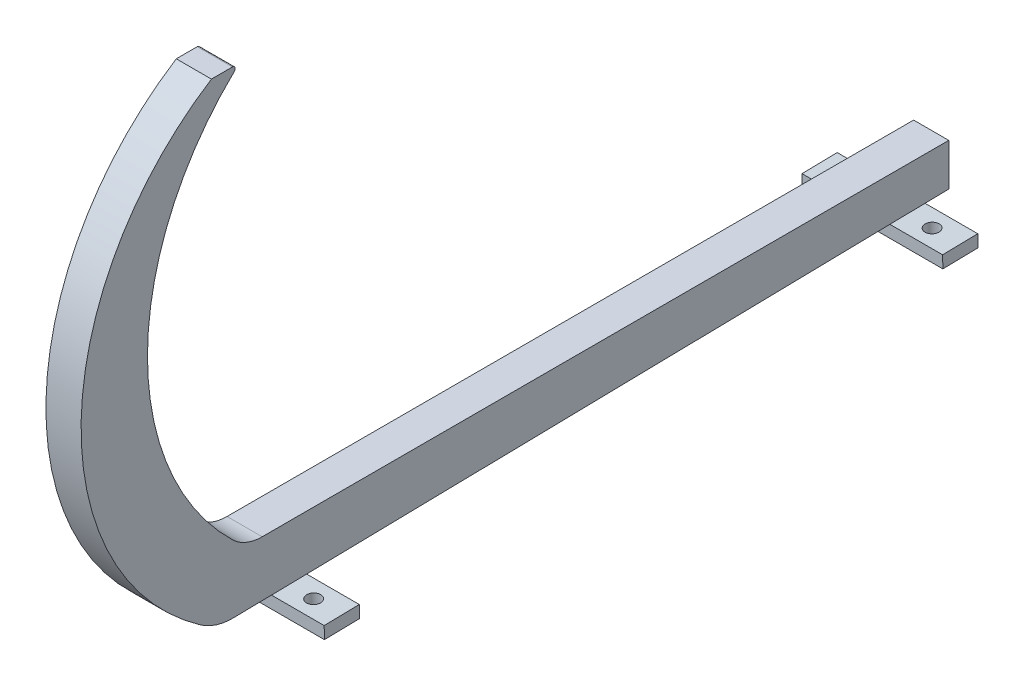
ISO-10303-21;
HEADER;
FILE_DESCRIPTION(('STEP AP214'),'2;1');
FILE_NAME('part.step','',(''),(''),'','','');
FILE_SCHEMA(('AUTOMOTIVE_DESIGN { 1 0 10303 214 1 1 1 1 }'));
ENDSEC;
DATA;
#1=APPLICATION_CONTEXT('core data for automotive mechanical design processes');
#2=APPLICATION_PROTOCOL_DEFINITION('international standard','automotive_design',2000,#1);
#3=PRODUCT_CONTEXT('',#1,'mechanical');
#4=PRODUCT('Part','Part','',(#3));
#5=PRODUCT_RELATED_PRODUCT_CATEGORY('part','',(#4));
#6=PRODUCT_DEFINITION_FORMATION('','',#4);
#7=PRODUCT_DEFINITION_CONTEXT('part definition',#1,'design');
#8=PRODUCT_DEFINITION('design','',#6,#7);
#9=PRODUCT_DEFINITION_SHAPE('','',#8);
#10=(LENGTH_UNIT() NAMED_UNIT(*) SI_UNIT(.MILLI.,.METRE.));
#11=(NAMED_UNIT(*) PLANE_ANGLE_UNIT() SI_UNIT($,.RADIAN.));
#12=(NAMED_UNIT(*) SI_UNIT($,.STERADIAN.) SOLID_ANGLE_UNIT());
#13=UNCERTAINTY_MEASURE_WITH_UNIT(LENGTH_MEASURE(1.E-05),#10,'distance_accuracy_value','');
#14=(GEOMETRIC_REPRESENTATION_CONTEXT(3) GLOBAL_UNCERTAINTY_ASSIGNED_CONTEXT((#13)) GLOBAL_UNIT_ASSIGNED_CONTEXT((#10,
#11,#12)) REPRESENTATION_CONTEXT('',''));
#15=CARTESIAN_POINT('',(0.,0.,0.));
#16=DIRECTION('',(0.,0.,1.));
#17=DIRECTION('',(1.,0.,0.));
#18=AXIS2_PLACEMENT_3D('',#15,#16,#17);
#19=CARTESIAN_POINT('',(15.875,-38.1,-317.5));
#20=DIRECTION('',(0.,0.999815576773598,0.0192044901228458));
#21=DIRECTION('',(0.,-0.0192044901228458,0.999815576773598));
#22=AXIS2_PLACEMENT_3D('',#19,#20,#21);
#23=PLANE('',#22);
#24=DIRECTION('',(1.,0.,0.));
#25=VECTOR('',#24,1.);
#26=CARTESIAN_POINT('',(-63.5000000000001,-49.2431126127245,262.627745786432));
#27=LINE('',#26,#25);
#28=CARTESIAN_POINT('',(-15.875,-49.2431126127245,262.627745786431));
#29=VERTEX_POINT('',#28);
#30=CARTESIAN_POINT('',(15.875,-49.2431126127245,262.627745786431));
#31=VERTEX_POINT('',#30);
#32=EDGE_CURVE('E326',#29,#31,#27,.T.);
#33=ORIENTED_EDGE('',*,*,#32,.F.);
#34=DIRECTION('',(0.,0.0192044901228458,-0.999815576773597));
#35=VECTOR('',#34,1.);
#36=CARTESIAN_POINT('',(-15.875,-38.1,-317.5));
#37=LINE('',#36,#35);
#38=CARTESIAN_POINT('',(-15.875,-39.1213860934786,-264.325053952093));
#39=VERTEX_POINT('',#38);
#40=EDGE_CURVE('E419',#29,#39,#37,.T.);
#41=ORIENTED_EDGE('',*,*,#40,.T.);
#42=DIRECTION('',(-1.,0.,0.));
#43=VECTOR('',#42,1.);
#44=CARTESIAN_POINT('',(-63.5000000000001,-39.1213860934786,-264.325053952093));
#45=LINE('',#44,#43);
#46=CARTESIAN_POINT('',(15.875,-39.1213860934786,-264.325053952093));
#47=VERTEX_POINT('',#46);
#48=EDGE_CURVE('E237',#47,#39,#45,.T.);
#49=ORIENTED_EDGE('',*,*,#48,.F.);
#50=DIRECTION('',(0.,0.0192044901228458,-0.999815576773597));
#51=VECTOR('',#50,1.);
#52=CARTESIAN_POINT('',(15.875,-38.1,-317.5));
#53=LINE('',#52,#51);
#54=EDGE_CURVE('E433',#31,#47,#53,.T.);
#55=ORIENTED_EDGE('',*,*,#54,.F.);
#56=EDGE_LOOP('',(#33,#41,#49,#55));
#57=FACE_BOUND('',#56,.T.);
#58=ADVANCED_FACE('F39',(#57),#23,.F.);
#59=DIRECTION('',(-1.,0.,0.));
#60=VECTOR('',#59,1.);
#61=CARTESIAN_POINT('',(-63.5000000000001,-49.8528551741249,294.371890348993));
#62=LINE('',#61,#60);
#63=CARTESIAN_POINT('',(15.875,-49.8528551741249,294.371890348993));
#64=VERTEX_POINT('',#63);
#65=CARTESIAN_POINT('',(-15.875,-49.8528551741249,294.371890348993));
#66=VERTEX_POINT('',#65);
#67=EDGE_CURVE('E332',#64,#66,#62,.T.);
#68=ORIENTED_EDGE('',*,*,#67,.F.);
#69=CARTESIAN_POINT('',(15.875,-50.500975577727,328.11404497018));
#70=VERTEX_POINT('',#69);
#71=EDGE_CURVE('E283',#70,#64,#53,.T.);
#72=ORIENTED_EDGE('',*,*,#71,.F.);
#73=DIRECTION('',(-1.,0.,0.));
#74=VECTOR('',#73,1.);
#75=CARTESIAN_POINT('',(15.875,-50.500975577727,328.11404497018));
#76=LINE('',#75,#74);
#77=CARTESIAN_POINT('',(-15.875,-50.500975577727,328.11404497018));
#78=VERTEX_POINT('',#77);
#79=EDGE_CURVE('E305',#70,#78,#76,.T.);
#80=ORIENTED_EDGE('',*,*,#79,.T.);
#81=EDGE_CURVE('E271',#78,#66,#37,.T.);
#82=ORIENTED_EDGE('',*,*,#81,.T.);
#83=EDGE_LOOP('',(#68,#72,#80,#82));
#84=FACE_BOUND('',#83,.T.);
#85=ADVANCED_FACE('F382',(#84),#23,.F.);
#86=DIRECTION('',(1.,0.,0.));
#87=VECTOR('',#86,1.);
#88=CARTESIAN_POINT('',(-63.5000000000001,-38.5116435320783,-296.069198514655));
#89=LINE('',#88,#87);
#90=CARTESIAN_POINT('',(-15.875,-38.5116435320783,-296.069198514655));
#91=VERTEX_POINT('',#90);
#92=CARTESIAN_POINT('',(15.875,-38.5116435320783,-296.069198514655));
#93=VERTEX_POINT('',#92);
#94=EDGE_CURVE('E245',#91,#93,#89,.T.);
#95=ORIENTED_EDGE('',*,*,#94,.F.);
#96=CARTESIAN_POINT('',(-15.875,-38.1,-317.5));
#97=VERTEX_POINT('',#96);
#98=EDGE_CURVE('E297',#91,#97,#37,.T.);
#99=ORIENTED_EDGE('',*,*,#98,.T.);
#100=DIRECTION('',(-1.,0.,0.));
#101=VECTOR('',#100,1.);
#102=CARTESIAN_POINT('',(15.875,-38.1,-317.5));
#103=LINE('',#102,#101);
#104=CARTESIAN_POINT('',(15.875,-38.1,-317.5));
#105=VERTEX_POINT('',#104);
#106=EDGE_CURVE('E286',#105,#97,#103,.T.);
#107=ORIENTED_EDGE('',*,*,#106,.F.);
#108=EDGE_CURVE('E285',#93,#105,#53,.T.);
#109=ORIENTED_EDGE('',*,*,#108,.F.);
#110=EDGE_LOOP('',(#95,#99,#107,#109));
#111=FACE_BOUND('',#110,.T.);
#112=ADVANCED_FACE('F387',(#111),#23,.F.);
#113=CARTESIAN_POINT('',(15.875,0.,-317.5));
#114=DIRECTION('',(0.,0.,1.));
#115=DIRECTION('',(1.,0.,0.));
#116=AXIS2_PLACEMENT_3D('',#113,#114,#115);
#117=PLANE('',#116);
#118=DIRECTION('',(0.,1.,0.));
#119=VECTOR('',#118,1.);
#120=CARTESIAN_POINT('',(-15.875,0.,-317.5));
#121=LINE('',#120,#119);
#122=CARTESIAN_POINT('',(-15.875,0.,-317.5));
#123=VERTEX_POINT('',#122);
#124=EDGE_CURVE('E207',#97,#123,#121,.T.);
#125=ORIENTED_EDGE('',*,*,#124,.T.);
#126=DIRECTION('',(-1.,0.,0.));
#127=VECTOR('',#126,1.);
#128=CARTESIAN_POINT('',(15.875,0.,-317.5));
#129=LINE('',#128,#127);
#130=CARTESIAN_POINT('',(15.875,0.,-317.5));
#131=VERTEX_POINT('',#130);
#132=EDGE_CURVE('E319',#131,#123,#129,.T.);
#133=ORIENTED_EDGE('',*,*,#132,.F.);
#134=DIRECTION('',(0.,1.,0.));
#135=VECTOR('',#134,1.);
#136=CARTESIAN_POINT('',(15.875,0.,-317.5));
#137=LINE('',#136,#135);
#138=EDGE_CURVE('E270',#105,#131,#137,.T.);
#139=ORIENTED_EDGE('',*,*,#138,.F.);
#140=ORIENTED_EDGE('',*,*,#106,.T.);
#141=EDGE_LOOP('',(#125,#133,#139,#140));
#142=FACE_BOUND('',#141,.T.);
#143=ADVANCED_FACE('F392',(#142),#117,.F.);
#144=CARTESIAN_POINT('',(15.875,0.,-317.5));
#145=DIRECTION('',(0.,-1.,0.));
#146=DIRECTION('',(0.,0.,-1.));
#147=AXIS2_PLACEMENT_3D('',#144,#145,#146);
#148=PLANE('',#147);
#149=DIRECTION('',(0.,0.,1.));
#150=VECTOR('',#149,1.);
#151=CARTESIAN_POINT('',(-15.875,0.,-317.5));
#152=LINE('',#151,#150);
#153=CARTESIAN_POINT('',(-15.875,0.,302.771488663165));
#154=VERTEX_POINT('',#153);
#155=EDGE_CURVE('E215',#123,#154,#152,.T.);
#156=ORIENTED_EDGE('',*,*,#155,.T.);
#157=DIRECTION('',(-1.,0.,0.));
#158=VECTOR('',#157,1.);
#159=CARTESIAN_POINT('',(15.875,0.,302.771488663165));
#160=LINE('',#159,#158);
#161=CARTESIAN_POINT('',(15.875,0.,302.771488663165));
#162=VERTEX_POINT('',#161);
#163=EDGE_CURVE('E320',#162,#154,#160,.T.);
#164=ORIENTED_EDGE('',*,*,#163,.F.);
#165=DIRECTION('',(0.,0.,1.));
#166=VECTOR('',#165,1.);
#167=CARTESIAN_POINT('',(15.875,0.,-317.5));
#168=LINE('',#167,#166);
#169=EDGE_CURVE('E269',#131,#162,#168,.T.);
#170=ORIENTED_EDGE('',*,*,#169,.F.);
#171=ORIENTED_EDGE('',*,*,#132,.T.);
#172=EDGE_LOOP('',(#156,#164,#170,#171));
#173=FACE_BOUND('',#172,.T.);
#174=ADVANCED_FACE('F402',(#173),#148,.F.);
#175=CARTESIAN_POINT('',(15.875,38.0999999999999,302.771488663165));
#176=DIRECTION('',(-1.,0.,0.));
#177=DIRECTION('',(0.,0.,1.));
#178=AXIS2_PLACEMENT_3D('',#175,#176,#177);
#179=CYLINDRICAL_SURFACE('',#178,38.1);
#180=CARTESIAN_POINT('',(-15.875,38.0999999999999,302.771488663165));
#181=DIRECTION('',(-1.,0.,0.));
#182=DIRECTION('',(0.,0.,1.));
#183=AXIS2_PLACEMENT_3D('',#180,#181,#182);
#184=CIRCLE('',#183,38.1);
#185=CARTESIAN_POINT('',(-15.875,10.7605961028798,329.307633721371));
#186=VERTEX_POINT('',#185);
#187=EDGE_CURVE('E290',#154,#186,#184,.T.);
#188=ORIENTED_EDGE('',*,*,#187,.T.);
#189=DIRECTION('',(-1.,0.,0.));
#190=VECTOR('',#189,1.);
#191=CARTESIAN_POINT('',(15.875,10.7605961028798,329.307633721371));
#192=LINE('',#191,#190);
#193=CARTESIAN_POINT('',(15.875,10.7605961028798,329.307633721371));
#194=VERTEX_POINT('',#193);
#195=EDGE_CURVE('E314',#194,#186,#192,.T.);
#196=ORIENTED_EDGE('',*,*,#195,.F.);
#197=CARTESIAN_POINT('',(15.875,38.0999999999999,302.771488663165));
#198=DIRECTION('',(-1.,0.,0.));
#199=DIRECTION('',(0.,0.,1.));
#200=AXIS2_PLACEMENT_3D('',#197,#198,#199);
#201=CIRCLE('',#200,38.1);
#202=EDGE_CURVE('E272',#162,#194,#201,.T.);
#203=ORIENTED_EDGE('',*,*,#202,.F.);
#204=ORIENTED_EDGE('',*,*,#163,.T.);
#205=EDGE_LOOP('',(#188,#196,#203,#204));
#206=FACE_BOUND('',#205,.T.);
#207=ADVANCED_FACE('F451',(#206),#179,.F.);
#208=CARTESIAN_POINT('',(15.875,193.023288750347,152.4));
#209=DIRECTION('',(-1.,0.,0.));
#210=DIRECTION('',(0.,0.,1.));
#211=AXIS2_PLACEMENT_3D('',#208,#209,#210);
#212=CYLINDRICAL_SURFACE('',#211,254.);
#213=CARTESIAN_POINT('',(-15.875,193.023288750347,152.4));
#214=DIRECTION('',(-1.,0.,0.));
#215=DIRECTION('',(0.,0.,1.));
#216=AXIS2_PLACEMENT_3D('',#213,#214,#215);
#217=CIRCLE('',#216,254.);
#218=CARTESIAN_POINT('',(-15.875,376.623992957924,327.918607032081));
#219=VERTEX_POINT('',#218);
#220=EDGE_CURVE('E295',#186,#219,#217,.T.);
#221=ORIENTED_EDGE('',*,*,#220,.T.);
#222=DIRECTION('',(-1.,0.,0.));
#223=VECTOR('',#222,1.);
#224=CARTESIAN_POINT('',(15.875,376.623992957924,327.918607032081));
#225=LINE('',#224,#223);
#226=CARTESIAN_POINT('',(15.875,376.623992957924,327.918607032081));
#227=VERTEX_POINT('',#226);
#228=EDGE_CURVE('E50',#219,#227,#225,.F.);
#229=ORIENTED_EDGE('',*,*,#228,.T.);
#230=CARTESIAN_POINT('',(15.875,193.023288750347,152.4));
#231=DIRECTION('',(-1.,0.,0.));
#232=DIRECTION('',(0.,0.,1.));
#233=AXIS2_PLACEMENT_3D('',#230,#231,#232);
#234=CIRCLE('',#233,254.);
#235=EDGE_CURVE('E274',#194,#227,#234,.T.);
#236=ORIENTED_EDGE('',*,*,#235,.F.);
#237=ORIENTED_EDGE('',*,*,#195,.T.);
#238=EDGE_LOOP('',(#221,#229,#236,#237));
#239=FACE_BOUND('',#238,.T.);
#240=ADVANCED_FACE('F454',(#239),#212,.F.);
#241=CARTESIAN_POINT('',(15.875,381.,348.62375721124));
#242=DIRECTION('',(0.,-1.,0.));
#243=DIRECTION('',(0.,0.,-1.));
#244=AXIS2_PLACEMENT_3D('',#241,#242,#243);
#245=PLANE('',#244);
#246=DIRECTION('',(0.,0.,1.));
#247=VECTOR('',#246,1.);
#248=CARTESIAN_POINT('',(15.875,381.,348.62375721124));
#249=LINE('',#248,#247);
#250=CARTESIAN_POINT('',(15.875,381.,329.673793102401));
#251=VERTEX_POINT('',#250);
#252=CARTESIAN_POINT('',(15.875,381.,348.62375721124));
#253=VERTEX_POINT('',#252);
#254=EDGE_CURVE('E280',#251,#253,#249,.T.);
#255=ORIENTED_EDGE('',*,*,#254,.F.);
#256=DIRECTION('',(-1.,0.,0.));
#257=VECTOR('',#256,1.);
#258=CARTESIAN_POINT('',(15.875,381.,329.673793102401));
#259=LINE('',#258,#257);
#260=CARTESIAN_POINT('',(-15.875,381.,329.673793102401));
#261=VERTEX_POINT('',#260);
#262=EDGE_CURVE('E323',#251,#261,#259,.T.);
#263=ORIENTED_EDGE('',*,*,#262,.T.);
#264=DIRECTION('',(0.,0.,1.));
#265=VECTOR('',#264,1.);
#266=CARTESIAN_POINT('',(-15.875,381.,348.62375721124));
#267=LINE('',#266,#265);
#268=CARTESIAN_POINT('',(-15.875,381.,348.62375721124));
#269=VERTEX_POINT('',#268);
#270=EDGE_CURVE('E294',#261,#269,#267,.T.);
#271=ORIENTED_EDGE('',*,*,#270,.T.);
#272=DIRECTION('',(-1.,0.,0.));
#273=VECTOR('',#272,1.);
#274=CARTESIAN_POINT('',(15.875,381.,348.62375721124));
#275=LINE('',#274,#273);
#276=EDGE_CURVE('E313',#253,#269,#275,.T.);
#277=ORIENTED_EDGE('',*,*,#276,.F.);
#278=EDGE_LOOP('',(#255,#263,#271,#277));
#279=FACE_BOUND('',#278,.T.);
#280=ADVANCED_FACE('F455',(#279),#245,.F.);
#281=CARTESIAN_POINT('',(15.875,166.631038126727,212.381516384927));
#282=DIRECTION('',(-1.,0.,0.));
#283=DIRECTION('',(0.,0.,1.));
#284=AXIS2_PLACEMENT_3D('',#281,#282,#283);
#285=CYLINDRICAL_SURFACE('',#284,254.);
#286=CARTESIAN_POINT('',(-15.875,166.631038126727,212.381516384927));
#287=DIRECTION('',(1.,0.,0.));
#288=DIRECTION('',(0.,0.,1.));
#289=AXIS2_PLACEMENT_3D('',#286,#287,#288);
#290=CIRCLE('',#289,254.);
#291=CARTESIAN_POINT('',(-15.875,-41.2956898787171,358.266662239294));
#292=VERTEX_POINT('',#291);
#293=EDGE_CURVE('E299',#269,#292,#290,.T.);
#294=ORIENTED_EDGE('',*,*,#293,.T.);
#295=DIRECTION('',(-1.,0.,0.));
#296=VECTOR('',#295,1.);
#297=CARTESIAN_POINT('',(15.875,-41.2956898787171,358.266662239294));
#298=LINE('',#297,#296);
#299=CARTESIAN_POINT('',(15.875,-41.2956898787171,358.266662239294));
#300=VERTEX_POINT('',#299);
#301=EDGE_CURVE('E306',#300,#292,#298,.T.);
#302=ORIENTED_EDGE('',*,*,#301,.F.);
#303=CARTESIAN_POINT('',(15.875,166.631038126727,212.381516384927));
#304=DIRECTION('',(1.,0.,0.));
#305=DIRECTION('',(0.,0.,1.));
#306=AXIS2_PLACEMENT_3D('',#303,#304,#305);
#307=CIRCLE('',#306,254.);
#308=EDGE_CURVE('E276',#253,#300,#307,.T.);
#309=ORIENTED_EDGE('',*,*,#308,.F.);
#310=ORIENTED_EDGE('',*,*,#276,.T.);
#311=EDGE_LOOP('',(#294,#302,#309,#310));
#312=FACE_BOUND('',#311,.T.);
#313=ADVANCED_FACE('F464',(#312),#285,.T.);
#314=CARTESIAN_POINT('',(15.875,0.289655722371815,329.089633068421));
#315=DIRECTION('',(-1.,0.,0.));
#316=DIRECTION('',(0.,0.,1.));
#317=AXIS2_PLACEMENT_3D('',#314,#315,#316);
#318=CYLINDRICAL_SURFACE('',#317,50.8);
#319=CARTESIAN_POINT('',(-15.875,0.289655722371815,329.089633068421));
#320=DIRECTION('',(1.,0.,0.));
#321=DIRECTION('',(0.,0.,1.));
#322=AXIS2_PLACEMENT_3D('',#319,#320,#321);
#323=CIRCLE('',#322,50.8);
#324=EDGE_CURVE('E300',#292,#78,#323,.T.);
#325=ORIENTED_EDGE('',*,*,#324,.T.);
#326=ORIENTED_EDGE('',*,*,#79,.F.);
#327=CARTESIAN_POINT('',(15.875,0.289655722371815,329.089633068421));
#328=DIRECTION('',(1.,0.,0.));
#329=DIRECTION('',(0.,0.,1.));
#330=AXIS2_PLACEMENT_3D('',#327,#328,#329);
#331=CIRCLE('',#330,50.8);
#332=EDGE_CURVE('E284',#300,#70,#331,.T.);
#333=ORIENTED_EDGE('',*,*,#332,.F.);
#334=ORIENTED_EDGE('',*,*,#301,.T.);
#335=EDGE_LOOP('',(#325,#326,#333,#334));
#336=FACE_BOUND('',#335,.T.);
#337=ADVANCED_FACE('F483',(#336),#318,.T.);
#338=CARTESIAN_POINT('',(15.875,0.289655722371815,329.089633068421));
#339=DIRECTION('',(-1.,0.,0.));
#340=DIRECTION('',(0.,0.,1.));
#341=AXIS2_PLACEMENT_3D('',#338,#339,#340);
#342=PLANE('',#341);
#343=ORIENTED_EDGE('',*,*,#235,.T.);
#344=CARTESIAN_POINT('',(15.875,378.46,329.673793102401));
#345=DIRECTION('',(-1.,0.,0.));
#346=DIRECTION('',(0.,0.,1.));
#347=AXIS2_PLACEMENT_3D('',#344,#345,#346);
#348=CIRCLE('',#347,2.54);
#349=EDGE_CURVE('E11',#227,#251,#348,.F.);
#350=ORIENTED_EDGE('',*,*,#349,.T.);
#351=ORIENTED_EDGE('',*,*,#254,.T.);
#352=ORIENTED_EDGE('',*,*,#308,.T.);
#353=ORIENTED_EDGE('',*,*,#332,.T.);
#354=ORIENTED_EDGE('',*,*,#71,.T.);
#355=EDGE_CURVE('E287',#64,#31,#53,.T.);
#356=ORIENTED_EDGE('',*,*,#355,.T.);
#357=ORIENTED_EDGE('',*,*,#54,.T.);
#358=EDGE_CURVE('E437',#47,#93,#53,.T.);
#359=ORIENTED_EDGE('',*,*,#358,.T.);
#360=ORIENTED_EDGE('',*,*,#108,.T.);
#361=ORIENTED_EDGE('',*,*,#138,.T.);
#362=ORIENTED_EDGE('',*,*,#169,.T.);
#363=ORIENTED_EDGE('',*,*,#202,.T.);
#364=EDGE_LOOP('',(#343,#350,#351,#352,#353,#354,#356,#357,#359,#360,#361,#362,#363));
#365=FACE_BOUND('',#364,.T.);
#366=ADVANCED_FACE('F440',(#365),#342,.F.);
#367=CARTESIAN_POINT('',(-15.875,0.289655722371815,329.089633068421));
#368=DIRECTION('',(-1.,0.,0.));
#369=DIRECTION('',(0.,0.,1.));
#370=AXIS2_PLACEMENT_3D('',#367,#368,#369);
#371=PLANE('',#370);
#372=ORIENTED_EDGE('',*,*,#270,.F.);
#373=CARTESIAN_POINT('',(-15.875,378.46,329.673793102401));
#374=DIRECTION('',(-1.,0.,0.));
#375=DIRECTION('',(0.,0.,1.));
#376=AXIS2_PLACEMENT_3D('',#373,#374,#375);
#377=CIRCLE('',#376,2.54);
#378=EDGE_CURVE('E64',#261,#219,#377,.T.);
#379=ORIENTED_EDGE('',*,*,#378,.T.);
#380=ORIENTED_EDGE('',*,*,#220,.F.);
#381=ORIENTED_EDGE('',*,*,#187,.F.);
#382=ORIENTED_EDGE('',*,*,#155,.F.);
#383=ORIENTED_EDGE('',*,*,#124,.F.);
#384=ORIENTED_EDGE('',*,*,#98,.F.);
#385=EDGE_CURVE('E414',#39,#91,#37,.T.);
#386=ORIENTED_EDGE('',*,*,#385,.F.);
#387=ORIENTED_EDGE('',*,*,#40,.F.);
#388=EDGE_CURVE('E302',#66,#29,#37,.T.);
#389=ORIENTED_EDGE('',*,*,#388,.F.);
#390=ORIENTED_EDGE('',*,*,#81,.F.);
#391=ORIENTED_EDGE('',*,*,#324,.F.);
#392=ORIENTED_EDGE('',*,*,#293,.F.);
#393=EDGE_LOOP('',(#372,#379,#380,#381,#382,#383,#384,#386,#387,#389,#390,#391,#392));
#394=FACE_BOUND('',#393,.T.);
#395=ADVANCED_FACE('F411',(#394),#371,.T.);
#396=CARTESIAN_POINT('',(0.,-44.1822493531016,-0.848654082830805));
#397=DIRECTION('',(0.,0.999815576773598,0.0192044901228458));
#398=DIRECTION('',(0.,-0.0192044901228458,0.999815576773598));
#399=AXIS2_PLACEMENT_3D('',#396,#397,#398);
#400=PLANE('',#399);
#401=CARTESIAN_POINT('',(38.1,-38.8165148127785,-280.197126233374));
#402=DIRECTION('',(0.,-0.999815576773598,-0.0192044901228458));
#403=DIRECTION('',(0.,-0.0192044901228458,0.999815576773598));
#404=AXIS2_PLACEMENT_3D('',#401,#402,#403);
#405=CIRCLE('',#404,6.35);
#406=CARTESIAN_POINT('',(38.1,-38.9384633250585,-273.848297320862));
#407=VERTEX_POINT('',#406);
#408=EDGE_CURVE('E261',#407,#407,#405,.T.);
#409=ORIENTED_EDGE('',*,*,#408,.T.);
#410=EDGE_LOOP('',(#409));
#411=FACE_BOUND('',#410,.T.);
#412=ORIENTED_EDGE('',*,*,#358,.F.);
#413=CARTESIAN_POINT('',(63.4999999999999,-39.1213860934786,-264.325053952093));
#414=VERTEX_POINT('',#413);
#415=EDGE_CURVE('E231',#414,#47,#45,.T.);
#416=ORIENTED_EDGE('',*,*,#415,.F.);
#417=DIRECTION('',(0.,-0.0192044901228458,0.999815576773597));
#418=VECTOR('',#417,1.);
#419=CARTESIAN_POINT('',(63.4999999999999,-38.5116435320783,-296.069198514655));
#420=LINE('',#419,#418);
#421=CARTESIAN_POINT('',(63.4999999999999,-38.5116435320783,-296.069198514655));
#422=VERTEX_POINT('',#421);
#423=EDGE_CURVE('E233',#422,#414,#420,.T.);
#424=ORIENTED_EDGE('',*,*,#423,.F.);
#425=EDGE_CURVE('E236',#93,#422,#89,.T.);
#426=ORIENTED_EDGE('',*,*,#425,.F.);
#427=EDGE_LOOP('',(#412,#416,#424,#426));
#428=FACE_BOUND('',#427,.T.);
#429=ADVANCED_FACE('F442',(#411,#428),#400,.T.);
#430=CARTESIAN_POINT('',(0.,-55.3561882391233,-1.06328346444373));
#431=DIRECTION('',(0.,0.999815576773598,0.0192044901228458));
#432=DIRECTION('',(0.,-0.0192044901228458,0.999815576773598));
#433=AXIS2_PLACEMENT_3D('',#430,#431,#432);
#434=PLANE('',#433);
#435=DIRECTION('',(0.,0.0192044901228458,-0.999815576773597));
#436=VECTOR('',#435,1.);
#437=CARTESIAN_POINT('',(-63.5000000000001,-49.6855824181,-296.283827896268));
#438=LINE('',#437,#436);
#439=CARTESIAN_POINT('',(-63.5000000000001,-50.2953249795004,-264.539683333706));
#440=VERTEX_POINT('',#439);
#441=CARTESIAN_POINT('',(-63.5000000000001,-49.6855824181,-296.283827896268));
#442=VERTEX_POINT('',#441);
#443=EDGE_CURVE('E252',#440,#442,#438,.T.);
#444=ORIENTED_EDGE('',*,*,#443,.T.);
#445=DIRECTION('',(1.,0.,0.));
#446=VECTOR('',#445,1.);
#447=CARTESIAN_POINT('',(-63.5000000000001,-49.6855824181,-296.283827896268));
#448=LINE('',#447,#446);
#449=CARTESIAN_POINT('',(63.4999999999999,-49.6855824181,-296.283827896268));
#450=VERTEX_POINT('',#449);
#451=EDGE_CURVE('E250',#442,#450,#448,.T.);
#452=ORIENTED_EDGE('',*,*,#451,.T.);
#453=DIRECTION('',(0.,-0.0192044901228458,0.999815576773597));
#454=VECTOR('',#453,1.);
#455=CARTESIAN_POINT('',(63.4999999999999,-49.6855824181,-296.283827896268));
#456=LINE('',#455,#454);
#457=CARTESIAN_POINT('',(63.4999999999999,-50.2953249795004,-264.539683333706));
#458=VERTEX_POINT('',#457);
#459=EDGE_CURVE('E249',#450,#458,#456,.T.);
#460=ORIENTED_EDGE('',*,*,#459,.T.);
#461=DIRECTION('',(-1.,0.,0.));
#462=VECTOR('',#461,1.);
#463=CARTESIAN_POINT('',(-63.5000000000001,-50.2953249795004,-264.539683333706));
#464=LINE('',#463,#462);
#465=EDGE_CURVE('E227',#458,#440,#464,.T.);
#466=ORIENTED_EDGE('',*,*,#465,.T.);
#467=EDGE_LOOP('',(#444,#452,#460,#466));
#468=FACE_BOUND('',#467,.T.);
#469=CARTESIAN_POINT('',(-38.1,-49.9904536988002,-280.411755614987));
#470=DIRECTION('',(0.,-0.999815576773598,-0.0192044901228458));
#471=DIRECTION('',(0.,-0.0192044901228458,0.999815576773598));
#472=AXIS2_PLACEMENT_3D('',#469,#470,#471);
#473=CIRCLE('',#472,6.35);
#474=CARTESIAN_POINT('',(-38.1,-50.1124022110803,-274.062926702474));
#475=VERTEX_POINT('',#474);
#476=EDGE_CURVE('E246',#475,#475,#473,.T.);
#477=ORIENTED_EDGE('',*,*,#476,.F.);
#478=EDGE_LOOP('',(#477));
#479=FACE_BOUND('',#478,.T.);
#480=CARTESIAN_POINT('',(38.1,-49.9904536988002,-280.411755614987));
#481=DIRECTION('',(0.,-0.999815576773598,-0.0192044901228458));
#482=DIRECTION('',(0.,-0.0192044901228458,0.999815576773598));
#483=AXIS2_PLACEMENT_3D('',#480,#481,#482);
#484=CIRCLE('',#483,6.35);
#485=CARTESIAN_POINT('',(38.1,-50.1124022110803,-274.062926702474));
#486=VERTEX_POINT('',#485);
#487=EDGE_CURVE('E256',#486,#486,#484,.T.);
#488=ORIENTED_EDGE('',*,*,#487,.F.);
#489=EDGE_LOOP('',(#488));
#490=FACE_BOUND('',#489,.T.);
#491=ADVANCED_FACE('F533',(#468,#479,#490),#434,.F.);
#492=CARTESIAN_POINT('',(-38.1,-38.8165148127785,-280.197126233374));
#493=DIRECTION('',(0.,-0.999815576773598,-0.0192044901228458));
#494=DIRECTION('',(0.,-0.0192044901228458,0.999815576773598));
#495=AXIS2_PLACEMENT_3D('',#492,#493,#494);
#496=CIRCLE('',#495,6.35);
#497=CARTESIAN_POINT('',(-38.1,-38.9384633250585,-273.848297320862));
#498=VERTEX_POINT('',#497);
#499=EDGE_CURVE('E254',#498,#498,#496,.T.);
#500=ORIENTED_EDGE('',*,*,#499,.T.);
#501=EDGE_LOOP('',(#500));
#502=FACE_BOUND('',#501,.T.);
#503=CARTESIAN_POINT('',(-63.5000000000001,-39.1213860934786,-264.325053952093));
#504=VERTEX_POINT('',#503);
#505=EDGE_CURVE('E235',#39,#504,#45,.T.);
#506=ORIENTED_EDGE('',*,*,#505,.F.);
#507=ORIENTED_EDGE('',*,*,#385,.T.);
#508=CARTESIAN_POINT('',(-63.5000000000001,-38.5116435320783,-296.069198514655));
#509=VERTEX_POINT('',#508);
#510=EDGE_CURVE('E239',#509,#91,#89,.T.);
#511=ORIENTED_EDGE('',*,*,#510,.F.);
#512=DIRECTION('',(0.,0.0192044901228458,-0.999815576773597));
#513=VECTOR('',#512,1.);
#514=CARTESIAN_POINT('',(-63.5000000000001,-38.5116435320783,-296.069198514655));
#515=LINE('',#514,#513);
#516=EDGE_CURVE('E241',#504,#509,#515,.T.);
#517=ORIENTED_EDGE('',*,*,#516,.F.);
#518=EDGE_LOOP('',(#506,#507,#511,#517));
#519=FACE_BOUND('',#518,.T.);
#520=ADVANCED_FACE('F417',(#502,#519),#400,.T.);
#521=CARTESIAN_POINT('',(-63.5000000000001,-49.6855824181,-296.283827896268));
#522=DIRECTION('',(1.,0.,0.));
#523=DIRECTION('',(0.,0.,-1.));
#524=AXIS2_PLACEMENT_3D('',#521,#522,#523);
#525=PLANE('',#524);
#526=ORIENTED_EDGE('',*,*,#516,.T.);
#527=DIRECTION('',(0.,0.999815576773598,0.0192044901228458));
#528=VECTOR('',#527,1.);
#529=CARTESIAN_POINT('',(-63.5000000000001,-49.6855824181,-296.283827896268));
#530=LINE('',#529,#528);
#531=EDGE_CURVE('E217',#442,#509,#530,.T.);
#532=ORIENTED_EDGE('',*,*,#531,.F.);
#533=ORIENTED_EDGE('',*,*,#443,.F.);
#534=DIRECTION('',(0.,0.999815576773598,0.0192044901228458));
#535=VECTOR('',#534,1.);
#536=CARTESIAN_POINT('',(-63.5000000000001,-50.2953249795004,-264.539683333706));
#537=LINE('',#536,#535);
#538=EDGE_CURVE('E226',#440,#504,#537,.T.);
#539=ORIENTED_EDGE('',*,*,#538,.T.);
#540=EDGE_LOOP('',(#526,#532,#533,#539));
#541=FACE_BOUND('',#540,.T.);
#542=ADVANCED_FACE('F426',(#541),#525,.F.);
#543=CARTESIAN_POINT('',(-63.5000000000001,-49.6855824181,-296.283827896268));
#544=DIRECTION('',(0.,-0.0192044901228458,0.999815576773598));
#545=DIRECTION('',(0.,-0.999815576773598,-0.0192044901228458));
#546=AXIS2_PLACEMENT_3D('',#543,#544,#545);
#547=PLANE('',#546);
#548=ORIENTED_EDGE('',*,*,#510,.T.);
#549=ORIENTED_EDGE('',*,*,#94,.T.);
#550=ORIENTED_EDGE('',*,*,#425,.T.);
#551=DIRECTION('',(0.,0.999815576773598,0.0192044901228458));
#552=VECTOR('',#551,1.);
#553=CARTESIAN_POINT('',(63.4999999999999,-49.6855824181,-296.283827896268));
#554=LINE('',#553,#552);
#555=EDGE_CURVE('E222',#450,#422,#554,.T.);
#556=ORIENTED_EDGE('',*,*,#555,.F.);
#557=ORIENTED_EDGE('',*,*,#451,.F.);
#558=ORIENTED_EDGE('',*,*,#531,.T.);
#559=EDGE_LOOP('',(#548,#549,#550,#556,#557,#558));
#560=FACE_BOUND('',#559,.T.);
#561=ADVANCED_FACE('F423',(#560),#547,.F.);
#562=CARTESIAN_POINT('',(63.4999999999999,-49.6855824181,-296.283827896268));
#563=DIRECTION('',(-1.,0.,0.));
#564=DIRECTION('',(0.,0.,1.));
#565=AXIS2_PLACEMENT_3D('',#562,#563,#564);
#566=PLANE('',#565);
#567=ORIENTED_EDGE('',*,*,#423,.T.);
#568=DIRECTION('',(0.,0.999815576773598,0.0192044901228458));
#569=VECTOR('',#568,1.);
#570=CARTESIAN_POINT('',(63.4999999999999,-50.2953249795004,-264.539683333706));
#571=LINE('',#570,#569);
#572=EDGE_CURVE('E221',#458,#414,#571,.T.);
#573=ORIENTED_EDGE('',*,*,#572,.F.);
#574=ORIENTED_EDGE('',*,*,#459,.F.);
#575=ORIENTED_EDGE('',*,*,#555,.T.);
#576=EDGE_LOOP('',(#567,#573,#574,#575));
#577=FACE_BOUND('',#576,.T.);
#578=ADVANCED_FACE('F567',(#577),#566,.F.);
#579=CARTESIAN_POINT('',(-63.5000000000001,-50.2953249795004,-264.539683333706));
#580=DIRECTION('',(0.,0.0192044901228458,-0.999815576773598));
#581=DIRECTION('',(0.,0.999815576773598,0.0192044901228458));
#582=AXIS2_PLACEMENT_3D('',#579,#580,#581);
#583=PLANE('',#582);
#584=ORIENTED_EDGE('',*,*,#415,.T.);
#585=ORIENTED_EDGE('',*,*,#48,.T.);
#586=ORIENTED_EDGE('',*,*,#505,.T.);
#587=ORIENTED_EDGE('',*,*,#538,.F.);
#588=ORIENTED_EDGE('',*,*,#465,.F.);
#589=ORIENTED_EDGE('',*,*,#572,.T.);
#590=EDGE_LOOP('',(#584,#585,#586,#587,#588,#589));
#591=FACE_BOUND('',#590,.T.);
#592=ADVANCED_FACE('F429',(#591),#583,.F.);
#593=CARTESIAN_POINT('',(-38.1,-49.9904536988002,-280.411755614987));
#594=DIRECTION('',(0.,0.999815576773598,0.0192044901228458));
#595=DIRECTION('',(0.,-0.0192044901228458,0.999815576773598));
#596=AXIS2_PLACEMENT_3D('',#593,#594,#595);
#597=CYLINDRICAL_SURFACE('',#596,6.35);
#598=ORIENTED_EDGE('',*,*,#476,.T.);
#599=EDGE_LOOP('',(#598));
#600=FACE_BOUND('',#599,.T.);
#601=ORIENTED_EDGE('',*,*,#499,.F.);
#602=EDGE_LOOP('',(#601));
#603=FACE_BOUND('',#602,.T.);
#604=ADVANCED_FACE('F585',(#600,#603),#597,.F.);
#605=CARTESIAN_POINT('',(38.1,-49.9904536988002,-280.411755614987));
#606=DIRECTION('',(0.,0.999815576773598,0.0192044901228458));
#607=DIRECTION('',(0.,-0.0192044901228458,0.999815576773598));
#608=AXIS2_PLACEMENT_3D('',#605,#606,#607);
#609=CYLINDRICAL_SURFACE('',#608,6.35);
#610=ORIENTED_EDGE('',*,*,#487,.T.);
#611=EDGE_LOOP('',(#610));
#612=FACE_BOUND('',#611,.T.);
#613=ORIENTED_EDGE('',*,*,#408,.F.);
#614=EDGE_LOOP('',(#613));
#615=FACE_BOUND('',#614,.T.);
#616=ADVANCED_FACE('F378',(#612,#615),#609,.F.);
#617=CARTESIAN_POINT('',(0.,-44.1822493531016,-0.848654082830805));
#618=DIRECTION('',(0.,-0.999815576773598,-0.0192044901228458));
#619=DIRECTION('',(0.,0.0192044901228458,-0.999815576773598));
#620=AXIS2_PLACEMENT_3D('',#617,#618,#619);
#621=PLANE('',#620);
#622=CARTESIAN_POINT('',(-38.1,-49.5479838934247,278.499818067712));
#623=DIRECTION('',(0.,-0.999815576773598,-0.0192044901228458));
#624=DIRECTION('',(0.,0.0192044901228458,-0.999815576773598));
#625=AXIS2_PLACEMENT_3D('',#622,#623,#624);
#626=CIRCLE('',#625,6.35);
#627=CARTESIAN_POINT('',(-38.1,-49.4260353811447,272.1509891552));
#628=VERTEX_POINT('',#627);
#629=EDGE_CURVE('E262',#628,#628,#626,.T.);
#630=ORIENTED_EDGE('',*,*,#629,.T.);
#631=EDGE_LOOP('',(#630));
#632=FACE_BOUND('',#631,.T.);
#633=CARTESIAN_POINT('',(-63.5000000000001,-49.8528551741249,294.371890348993));
#634=VERTEX_POINT('',#633);
#635=EDGE_CURVE('E338',#66,#634,#62,.T.);
#636=ORIENTED_EDGE('',*,*,#635,.F.);
#637=ORIENTED_EDGE('',*,*,#388,.T.);
#638=CARTESIAN_POINT('',(-63.5000000000001,-49.2431126127245,262.627745786432));
#639=VERTEX_POINT('',#638);
#640=EDGE_CURVE('E204',#639,#29,#27,.T.);
#641=ORIENTED_EDGE('',*,*,#640,.F.);
#642=DIRECTION('',(0.,0.0192044901228458,-0.999815576773597));
#643=VECTOR('',#642,1.);
#644=CARTESIAN_POINT('',(-63.5000000000001,-49.8528551741249,294.371890348993));
#645=LINE('',#644,#643);
#646=EDGE_CURVE('E342',#634,#639,#645,.T.);
#647=ORIENTED_EDGE('',*,*,#646,.F.);
#648=EDGE_LOOP('',(#636,#637,#641,#647));
#649=FACE_BOUND('',#648,.T.);
#650=ADVANCED_FACE('F369',(#632,#649),#621,.F.);
#651=CARTESIAN_POINT('',(0.,-55.3561882391233,-1.06328346444373));
#652=DIRECTION('',(0.,-0.999815576773598,-0.0192044901228458));
#653=DIRECTION('',(0.,0.0192044901228458,-0.999815576773598));
#654=AXIS2_PLACEMENT_3D('',#651,#652,#653);
#655=PLANE('',#654);
#656=CARTESIAN_POINT('',(38.1,-60.7219227794465,278.285188686099));
#657=DIRECTION('',(0.,-0.999815576773598,-0.0192044901228458));
#658=DIRECTION('',(0.,0.0192044901228458,-0.999815576773598));
#659=AXIS2_PLACEMENT_3D('',#656,#657,#658);
#660=CIRCLE('',#659,6.35);
#661=CARTESIAN_POINT('',(38.1,-60.5999742671664,271.936359773587));
#662=VERTEX_POINT('',#661);
#663=EDGE_CURVE('E348',#662,#662,#660,.T.);
#664=ORIENTED_EDGE('',*,*,#663,.F.);
#665=EDGE_LOOP('',(#664));
#666=FACE_BOUND('',#665,.T.);
#667=DIRECTION('',(0.,-0.0192044901228458,0.999815576773597));
#668=VECTOR('',#667,1.);
#669=CARTESIAN_POINT('',(63.4999999999999,-61.0267940601466,294.15726096738));
#670=LINE('',#669,#668);
#671=CARTESIAN_POINT('',(63.4999999999999,-60.4170514987463,262.413116404819));
#672=VERTEX_POINT('',#671);
#673=CARTESIAN_POINT('',(63.4999999999999,-61.0267940601466,294.15726096738));
#674=VERTEX_POINT('',#673);
#675=EDGE_CURVE('E193',#672,#674,#670,.T.);
#676=ORIENTED_EDGE('',*,*,#675,.T.);
#677=DIRECTION('',(-1.,0.,0.));
#678=VECTOR('',#677,1.);
#679=CARTESIAN_POINT('',(-63.5000000000001,-61.0267940601466,294.15726096738));
#680=LINE('',#679,#678);
#681=CARTESIAN_POINT('',(-63.5000000000001,-61.0267940601466,294.15726096738));
#682=VERTEX_POINT('',#681);
#683=EDGE_CURVE('E185',#674,#682,#680,.T.);
#684=ORIENTED_EDGE('',*,*,#683,.T.);
#685=DIRECTION('',(0.,0.0192044901228458,-0.999815576773597));
#686=VECTOR('',#685,1.);
#687=CARTESIAN_POINT('',(-63.5000000000001,-61.0267940601466,294.15726096738));
#688=LINE('',#687,#686);
#689=CARTESIAN_POINT('',(-63.5000000000001,-60.4170514987463,262.413116404819));
#690=VERTEX_POINT('',#689);
#691=EDGE_CURVE('E194',#682,#690,#688,.T.);
#692=ORIENTED_EDGE('',*,*,#691,.T.);
#693=DIRECTION('',(1.,0.,0.));
#694=VECTOR('',#693,1.);
#695=CARTESIAN_POINT('',(-63.5000000000001,-60.4170514987463,262.413116404819));
#696=LINE('',#695,#694);
#697=EDGE_CURVE('E199',#690,#672,#696,.T.);
#698=ORIENTED_EDGE('',*,*,#697,.T.);
#699=EDGE_LOOP('',(#676,#684,#692,#698));
#700=FACE_BOUND('',#699,.T.);
#701=CARTESIAN_POINT('',(-38.1,-60.7219227794465,278.285188686099));
#702=DIRECTION('',(0.,-0.999815576773598,-0.0192044901228458));
#703=DIRECTION('',(0.,0.0192044901228458,-0.999815576773598));
#704=AXIS2_PLACEMENT_3D('',#701,#702,#703);
#705=CIRCLE('',#704,6.35);
#706=CARTESIAN_POINT('',(-38.1,-60.5999742671664,271.936359773587));
#707=VERTEX_POINT('',#706);
#708=EDGE_CURVE('E357',#707,#707,#705,.T.);
#709=ORIENTED_EDGE('',*,*,#708,.F.);
#710=EDGE_LOOP('',(#709));
#711=FACE_BOUND('',#710,.T.);
#712=ADVANCED_FACE('F197',(#666,#700,#711),#655,.T.);
#713=ORIENTED_EDGE('',*,*,#355,.F.);
#714=CARTESIAN_POINT('',(63.4999999999999,-49.8528551741249,294.371890348993));
#715=VERTEX_POINT('',#714);
#716=EDGE_CURVE('E340',#715,#64,#62,.T.);
#717=ORIENTED_EDGE('',*,*,#716,.F.);
#718=DIRECTION('',(0.,-0.0192044901228458,0.999815576773597));
#719=VECTOR('',#718,1.);
#720=CARTESIAN_POINT('',(63.4999999999999,-49.8528551741249,294.371890348993));
#721=LINE('',#720,#719);
#722=CARTESIAN_POINT('',(63.4999999999999,-49.2431126127245,262.627745786432));
#723=VERTEX_POINT('',#722);
#724=EDGE_CURVE('E208',#723,#715,#721,.T.);
#725=ORIENTED_EDGE('',*,*,#724,.F.);
#726=EDGE_CURVE('E334',#31,#723,#27,.T.);
#727=ORIENTED_EDGE('',*,*,#726,.F.);
#728=EDGE_LOOP('',(#713,#717,#725,#727));
#729=FACE_BOUND('',#728,.T.);
#730=CARTESIAN_POINT('',(38.1,-49.5479838934247,278.499818067712));
#731=DIRECTION('',(0.,-0.999815576773598,-0.0192044901228458));
#732=DIRECTION('',(0.,0.0192044901228458,-0.999815576773598));
#733=AXIS2_PLACEMENT_3D('',#730,#731,#732);
#734=CIRCLE('',#733,6.35);
#735=CARTESIAN_POINT('',(38.1,-49.4260353811447,272.1509891552));
#736=VERTEX_POINT('',#735);
#737=EDGE_CURVE('E353',#736,#736,#734,.T.);
#738=ORIENTED_EDGE('',*,*,#737,.T.);
#739=EDGE_LOOP('',(#738));
#740=FACE_BOUND('',#739,.T.);
#741=ADVANCED_FACE('F366',(#729,#740),#621,.F.);
#742=CARTESIAN_POINT('',(63.4999999999999,-61.0267940601466,294.15726096738));
#743=DIRECTION('',(-1.,0.,0.));
#744=DIRECTION('',(0.,0.,1.));
#745=AXIS2_PLACEMENT_3D('',#742,#743,#744);
#746=PLANE('',#745);
#747=ORIENTED_EDGE('',*,*,#724,.T.);
#748=DIRECTION('',(0.,0.999815576773598,0.0192044901228458));
#749=VECTOR('',#748,1.);
#750=CARTESIAN_POINT('',(63.4999999999999,-61.0267940601466,294.15726096738));
#751=LINE('',#750,#749);
#752=EDGE_CURVE('E186',#674,#715,#751,.T.);
#753=ORIENTED_EDGE('',*,*,#752,.F.);
#754=ORIENTED_EDGE('',*,*,#675,.F.);
#755=DIRECTION('',(0.,0.999815576773598,0.0192044901228458));
#756=VECTOR('',#755,1.);
#757=CARTESIAN_POINT('',(63.4999999999999,-60.4170514987463,262.413116404819));
#758=LINE('',#757,#756);
#759=EDGE_CURVE('E351',#672,#723,#758,.T.);
#760=ORIENTED_EDGE('',*,*,#759,.T.);
#761=EDGE_LOOP('',(#747,#753,#754,#760));
#762=FACE_BOUND('',#761,.T.);
#763=ADVANCED_FACE('F206',(#762),#746,.F.);
#764=CARTESIAN_POINT('',(-63.5000000000001,-61.0267940601466,294.15726096738));
#765=DIRECTION('',(0.,0.0192044901228458,-0.999815576773598));
#766=DIRECTION('',(0.,0.999815576773598,0.0192044901228458));
#767=AXIS2_PLACEMENT_3D('',#764,#765,#766);
#768=PLANE('',#767);
#769=ORIENTED_EDGE('',*,*,#716,.T.);
#770=ORIENTED_EDGE('',*,*,#67,.T.);
#771=ORIENTED_EDGE('',*,*,#635,.T.);
#772=DIRECTION('',(0.,0.999815576773598,0.0192044901228458));
#773=VECTOR('',#772,1.);
#774=CARTESIAN_POINT('',(-63.5000000000001,-61.0267940601466,294.15726096738));
#775=LINE('',#774,#773);
#776=EDGE_CURVE('E187',#682,#634,#775,.T.);
#777=ORIENTED_EDGE('',*,*,#776,.F.);
#778=ORIENTED_EDGE('',*,*,#683,.F.);
#779=ORIENTED_EDGE('',*,*,#752,.T.);
#780=EDGE_LOOP('',(#769,#770,#771,#777,#778,#779));
#781=FACE_BOUND('',#780,.T.);
#782=ADVANCED_FACE('F183',(#781),#768,.F.);
#783=CARTESIAN_POINT('',(-63.5000000000001,-61.0267940601466,294.15726096738));
#784=DIRECTION('',(1.,0.,0.));
#785=DIRECTION('',(0.,0.,-1.));
#786=AXIS2_PLACEMENT_3D('',#783,#784,#785);
#787=PLANE('',#786);
#788=ORIENTED_EDGE('',*,*,#646,.T.);
#789=DIRECTION('',(0.,0.999815576773598,0.0192044901228458));
#790=VECTOR('',#789,1.);
#791=CARTESIAN_POINT('',(-63.5000000000001,-60.4170514987463,262.413116404819));
#792=LINE('',#791,#790);
#793=EDGE_CURVE('E212',#690,#639,#792,.T.);
#794=ORIENTED_EDGE('',*,*,#793,.F.);
#795=ORIENTED_EDGE('',*,*,#691,.F.);
#796=ORIENTED_EDGE('',*,*,#776,.T.);
#797=EDGE_LOOP('',(#788,#794,#795,#796));
#798=FACE_BOUND('',#797,.T.);
#799=ADVANCED_FACE('F635',(#798),#787,.F.);
#800=CARTESIAN_POINT('',(-63.5000000000001,-60.4170514987463,262.413116404819));
#801=DIRECTION('',(0.,-0.0192044901228458,0.999815576773598));
#802=DIRECTION('',(0.,-0.999815576773598,-0.0192044901228458));
#803=AXIS2_PLACEMENT_3D('',#800,#801,#802);
#804=PLANE('',#803);
#805=ORIENTED_EDGE('',*,*,#640,.T.);
#806=ORIENTED_EDGE('',*,*,#32,.T.);
#807=ORIENTED_EDGE('',*,*,#726,.T.);
#808=ORIENTED_EDGE('',*,*,#759,.F.);
#809=ORIENTED_EDGE('',*,*,#697,.F.);
#810=ORIENTED_EDGE('',*,*,#793,.T.);
#811=EDGE_LOOP('',(#805,#806,#807,#808,#809,#810));
#812=FACE_BOUND('',#811,.T.);
#813=ADVANCED_FACE('F644',(#812),#804,.F.);
#814=CARTESIAN_POINT('',(38.1,-60.7219227794465,278.285188686099));
#815=DIRECTION('',(0.,0.999815576773598,0.0192044901228458));
#816=DIRECTION('',(0.,-0.0192044901228458,0.999815576773598));
#817=AXIS2_PLACEMENT_3D('',#814,#815,#816);
#818=CYLINDRICAL_SURFACE('',#817,6.35);
#819=ORIENTED_EDGE('',*,*,#663,.T.);
#820=EDGE_LOOP('',(#819));
#821=FACE_BOUND('',#820,.T.);
#822=ORIENTED_EDGE('',*,*,#737,.F.);
#823=EDGE_LOOP('',(#822));
#824=FACE_BOUND('',#823,.T.);
#825=ADVANCED_FACE('F653',(#821,#824),#818,.F.);
#826=CARTESIAN_POINT('',(-38.1,-60.7219227794465,278.285188686099));
#827=DIRECTION('',(0.,0.999815576773598,0.0192044901228458));
#828=DIRECTION('',(0.,-0.0192044901228458,0.999815576773598));
#829=AXIS2_PLACEMENT_3D('',#826,#827,#828);
#830=CYLINDRICAL_SURFACE('',#829,6.35);
#831=ORIENTED_EDGE('',*,*,#708,.T.);
#832=EDGE_LOOP('',(#831));
#833=FACE_BOUND('',#832,.T.);
#834=ORIENTED_EDGE('',*,*,#629,.F.);
#835=EDGE_LOOP('',(#834));
#836=FACE_BOUND('',#835,.T.);
#837=ADVANCED_FACE('F364',(#833,#836),#830,.F.);
#838=CARTESIAN_POINT('',(15.875,378.46,329.673793102401));
#839=DIRECTION('',(-1.,0.,0.));
#840=DIRECTION('',(0.,0.,1.));
#841=AXIS2_PLACEMENT_3D('',#838,#839,#840);
#842=CYLINDRICAL_SURFACE('',#841,2.54);
#843=ORIENTED_EDGE('',*,*,#349,.F.);
#844=ORIENTED_EDGE('',*,*,#228,.F.);
#845=ORIENTED_EDGE('',*,*,#378,.F.);
#846=ORIENTED_EDGE('',*,*,#262,.F.);
#847=EDGE_LOOP('',(#843,#844,#845,#846));
#848=FACE_BOUND('',#847,.T.);
#849=ADVANCED_FACE('F41',(#848),#842,.T.);
#850=CLOSED_SHELL('',(#58,#85,#112,#143,#174,#207,#240,#280,#313,#337,#366,#395,#429,#491,#520,
#542,#561,#578,#592,#604,#616,#650,#712,#741,#763,#782,#799,#813,#825,#837,#849));
#851=MANIFOLD_SOLID_BREP('B2',#850);
#852=ADVANCED_BREP_SHAPE_REPRESENTATION('',(#18,#851),#14);
#853=SHAPE_DEFINITION_REPRESENTATION(#9,#852);
ENDSEC;
END-ISO-10303-21;
